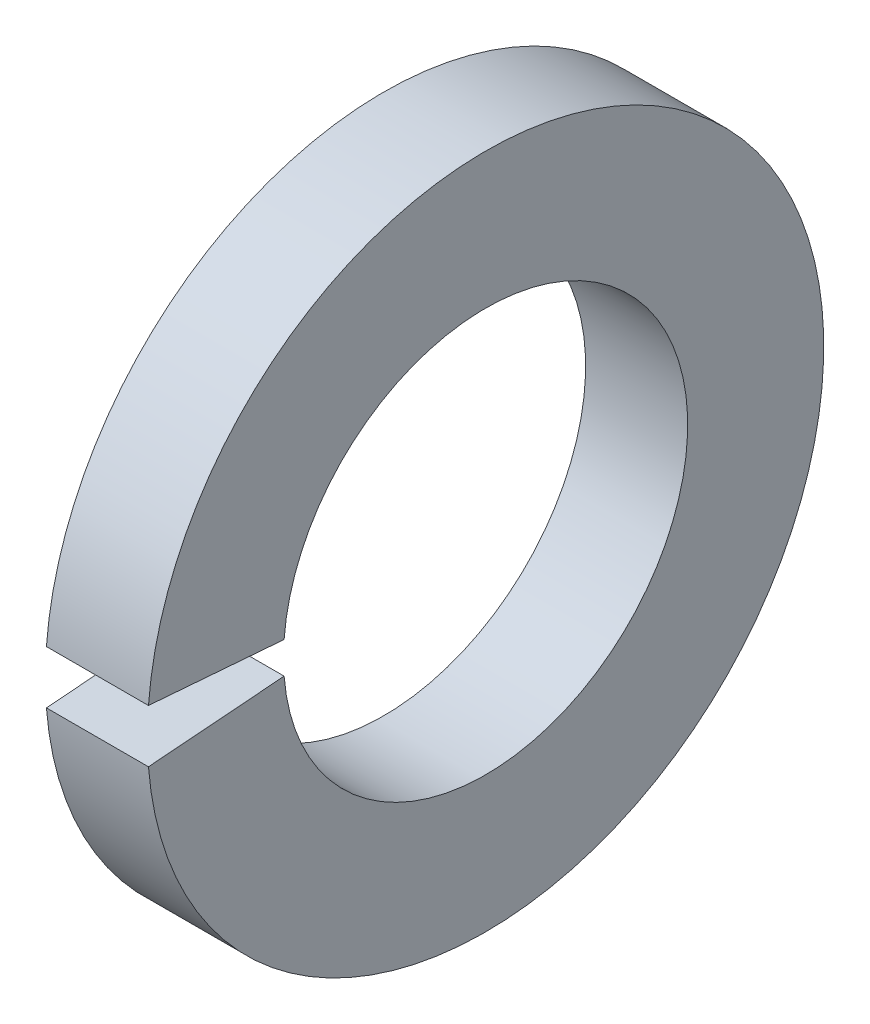
ISO-10303-21;
HEADER;
FILE_DESCRIPTION(('STEP AP214'),'2;1');
FILE_NAME('part.step','',(''),(''),'','','');
FILE_SCHEMA(('AUTOMOTIVE_DESIGN { 1 0 10303 214 1 1 1 1 }'));
ENDSEC;
DATA;
#1=APPLICATION_CONTEXT('core data for automotive mechanical design processes');
#2=APPLICATION_PROTOCOL_DEFINITION('international standard','automotive_design',2000,#1);
#3=PRODUCT_CONTEXT('',#1,'mechanical');
#4=PRODUCT('Part','Part','',(#3));
#5=PRODUCT_RELATED_PRODUCT_CATEGORY('part','',(#4));
#6=PRODUCT_DEFINITION_FORMATION('','',#4);
#7=PRODUCT_DEFINITION_CONTEXT('part definition',#1,'design');
#8=PRODUCT_DEFINITION('design','',#6,#7);
#9=PRODUCT_DEFINITION_SHAPE('','',#8);
#10=(LENGTH_UNIT() NAMED_UNIT(*) SI_UNIT(.MILLI.,.METRE.));
#11=(NAMED_UNIT(*) PLANE_ANGLE_UNIT() SI_UNIT($,.RADIAN.));
#12=(NAMED_UNIT(*) SI_UNIT($,.STERADIAN.) SOLID_ANGLE_UNIT());
#13=UNCERTAINTY_MEASURE_WITH_UNIT(LENGTH_MEASURE(1.E-05),#10,'distance_accuracy_value','');
#14=(GEOMETRIC_REPRESENTATION_CONTEXT(3) GLOBAL_UNCERTAINTY_ASSIGNED_CONTEXT((#13)) GLOBAL_UNIT_ASSIGNED_CONTEXT((#10,
#11,#12)) REPRESENTATION_CONTEXT('',''));
#15=CARTESIAN_POINT('',(0.,0.,0.));
#16=DIRECTION('',(0.,0.,1.));
#17=DIRECTION('',(1.,0.,0.));
#18=AXIS2_PLACEMENT_3D('',#15,#16,#17);
#19=CARTESIAN_POINT('',(-34.9249999999999,0.,0.));
#20=DIRECTION('',(-1.,0.,0.));
#21=DIRECTION('',(0.,0.,1.));
#22=AXIS2_PLACEMENT_3D('',#19,#20,#21);
#23=CYLINDRICAL_SURFACE('',#22,10.1);
#24=CARTESIAN_POINT('',(0.,0.,0.));
#25=DIRECTION('',(-1.,0.,0.));
#26=DIRECTION('',(0.,0.,1.));
#27=AXIS2_PLACEMENT_3D('',#24,#25,#26);
#28=CIRCLE('',#27,10.1);
#29=CARTESIAN_POINT('',(0.,0.792436866851241,10.0688650707046));
#30=VERTEX_POINT('',#29);
#31=CARTESIAN_POINT('',(0.,-0.792436866851241,10.0688650707046));
#32=VERTEX_POINT('',#31);
#33=EDGE_CURVE('E83',#30,#32,#28,.T.);
#34=ORIENTED_EDGE('',*,*,#33,.F.);
#35=DIRECTION('',(-1.,0.,0.));
#36=VECTOR('',#35,1.);
#37=CARTESIAN_POINT('',(-34.9249999999999,0.792436866851241,10.0688650707046));
#38=LINE('',#37,#36);
#39=CARTESIAN_POINT('',(-5.1,0.792436866851241,10.0688650707046));
#40=VERTEX_POINT('',#39);
#41=EDGE_CURVE('E97',#30,#40,#38,.T.);
#42=ORIENTED_EDGE('',*,*,#41,.T.);
#43=CARTESIAN_POINT('',(-5.1,0.,0.));
#44=DIRECTION('',(-1.,0.,0.));
#45=DIRECTION('',(0.,0.,1.));
#46=AXIS2_PLACEMENT_3D('',#43,#44,#45);
#47=CIRCLE('',#46,10.1);
#48=CARTESIAN_POINT('',(-5.1,-0.792436866851241,10.0688650707046));
#49=VERTEX_POINT('',#48);
#50=EDGE_CURVE('E85',#40,#49,#47,.T.);
#51=ORIENTED_EDGE('',*,*,#50,.T.);
#52=DIRECTION('',(-1.,0.,0.));
#53=VECTOR('',#52,1.);
#54=CARTESIAN_POINT('',(-34.9249999999999,-0.792436866851241,10.0688650707046));
#55=LINE('',#54,#53);
#56=EDGE_CURVE('E53',#32,#49,#55,.T.);
#57=ORIENTED_EDGE('',*,*,#56,.F.);
#58=EDGE_LOOP('',(#34,#42,#51,#57));
#59=FACE_BOUND('',#58,.T.);
#60=ADVANCED_FACE('F32',(#59),#23,.F.);
#61=CARTESIAN_POINT('',(0.,10.1,0.));
#62=DIRECTION('',(-1.,0.,0.));
#63=DIRECTION('',(0.,0.,1.));
#64=AXIS2_PLACEMENT_3D('',#61,#62,#63);
#65=PLANE('',#64);
#66=CARTESIAN_POINT('',(0.,0.,0.));
#67=DIRECTION('',(-1.,0.,0.));
#68=DIRECTION('',(0.,0.,1.));
#69=AXIS2_PLACEMENT_3D('',#66,#67,#68);
#70=CIRCLE('',#69,16.9);
#71=CARTESIAN_POINT('',(0.,1.32595871780059,16.8479029400899));
#72=VERTEX_POINT('',#71);
#73=CARTESIAN_POINT('',(0.,-1.32595871780059,16.8479029400899));
#74=VERTEX_POINT('',#73);
#75=EDGE_CURVE('E89',#72,#74,#70,.T.);
#76=ORIENTED_EDGE('',*,*,#75,.F.);
#77=DIRECTION('',(0.,0.0784590957278456,0.996917333733128));
#78=VECTOR('',#77,1.);
#79=CARTESIAN_POINT('',(0.,0.,0.));
#80=LINE('',#79,#78);
#81=EDGE_CURVE('E77',#30,#72,#80,.T.);
#82=ORIENTED_EDGE('',*,*,#81,.F.);
#83=ORIENTED_EDGE('',*,*,#33,.T.);
#84=DIRECTION('',(0.,-0.0784590957278456,0.996917333733128));
#85=VECTOR('',#84,1.);
#86=CARTESIAN_POINT('',(0.,0.,0.));
#87=LINE('',#86,#85);
#88=EDGE_CURVE('E69',#32,#74,#87,.T.);
#89=ORIENTED_EDGE('',*,*,#88,.T.);
#90=EDGE_LOOP('',(#76,#82,#83,#89));
#91=FACE_BOUND('',#90,.T.);
#92=ADVANCED_FACE('F88',(#91),#65,.F.);
#93=CARTESIAN_POINT('',(-34.9249999999999,0.,0.));
#94=DIRECTION('',(-1.,0.,0.));
#95=DIRECTION('',(0.,0.,1.));
#96=AXIS2_PLACEMENT_3D('',#93,#94,#95);
#97=CYLINDRICAL_SURFACE('',#96,16.9);
#98=CARTESIAN_POINT('',(-5.1,0.,0.));
#99=DIRECTION('',(-1.,0.,0.));
#100=DIRECTION('',(0.,0.,1.));
#101=AXIS2_PLACEMENT_3D('',#98,#99,#100);
#102=CIRCLE('',#101,16.9);
#103=CARTESIAN_POINT('',(-5.1,1.32595871780059,16.8479029400899));
#104=VERTEX_POINT('',#103);
#105=CARTESIAN_POINT('',(-5.1,-1.32595871780059,16.8479029400899));
#106=VERTEX_POINT('',#105);
#107=EDGE_CURVE('E91',#104,#106,#102,.T.);
#108=ORIENTED_EDGE('',*,*,#107,.F.);
#109=DIRECTION('',(-1.,0.,0.));
#110=VECTOR('',#109,1.);
#111=CARTESIAN_POINT('',(-34.9249999999999,1.32595871780059,16.8479029400899));
#112=LINE('',#111,#110);
#113=EDGE_CURVE('E46',#104,#72,#112,.F.);
#114=ORIENTED_EDGE('',*,*,#113,.T.);
#115=ORIENTED_EDGE('',*,*,#75,.T.);
#116=DIRECTION('',(-1.,0.,0.));
#117=VECTOR('',#116,1.);
#118=CARTESIAN_POINT('',(-34.9249999999999,-1.32595871780059,16.8479029400899));
#119=LINE('',#118,#117);
#120=EDGE_CURVE('E72',#106,#74,#119,.F.);
#121=ORIENTED_EDGE('',*,*,#120,.F.);
#122=EDGE_LOOP('',(#108,#114,#115,#121));
#123=FACE_BOUND('',#122,.T.);
#124=ADVANCED_FACE('F104',(#123),#97,.T.);
#125=CARTESIAN_POINT('',(-5.1,16.9,0.));
#126=DIRECTION('',(1.,0.,0.));
#127=DIRECTION('',(0.,0.,-1.));
#128=AXIS2_PLACEMENT_3D('',#125,#126,#127);
#129=PLANE('',#128);
#130=ORIENTED_EDGE('',*,*,#50,.F.);
#131=DIRECTION('',(0.,0.0784590957278456,0.996917333733128));
#132=VECTOR('',#131,1.);
#133=CARTESIAN_POINT('',(-5.1,0.104033521971088,1.32187122958996));
#134=LINE('',#133,#132);
#135=EDGE_CURVE('E11',#40,#104,#134,.T.);
#136=ORIENTED_EDGE('',*,*,#135,.T.);
#137=ORIENTED_EDGE('',*,*,#107,.T.);
#138=DIRECTION('',(0.,-0.0784590957278456,0.996917333733128));
#139=VECTOR('',#138,1.);
#140=CARTESIAN_POINT('',(-5.1,0.104033521971088,-1.32187122958996));
#141=LINE('',#140,#139);
#142=EDGE_CURVE('E39',#49,#106,#141,.T.);
#143=ORIENTED_EDGE('',*,*,#142,.F.);
#144=EDGE_LOOP('',(#130,#136,#137,#143));
#145=FACE_BOUND('',#144,.T.);
#146=ADVANCED_FACE('F106',(#145),#129,.F.);
#147=CARTESIAN_POINT('',(-5.1,0.,0.));
#148=DIRECTION('',(0.,0.996917333733128,0.0784590957278456));
#149=DIRECTION('',(0.,-0.0784590957278456,0.996917333733128));
#150=AXIS2_PLACEMENT_3D('',#147,#148,#149);
#151=PLANE('',#150);
#152=ORIENTED_EDGE('',*,*,#56,.T.);
#153=ORIENTED_EDGE('',*,*,#142,.T.);
#154=ORIENTED_EDGE('',*,*,#120,.T.);
#155=ORIENTED_EDGE('',*,*,#88,.F.);
#156=EDGE_LOOP('',(#152,#153,#154,#155));
#157=FACE_BOUND('',#156,.T.);
#158=ADVANCED_FACE('F70',(#157),#151,.T.);
#159=CARTESIAN_POINT('',(-5.1,0.,0.));
#160=DIRECTION('',(0.,0.996917333733128,-0.0784590957278456));
#161=DIRECTION('',(0.,0.0784590957278456,0.996917333733128));
#162=AXIS2_PLACEMENT_3D('',#159,#160,#161);
#163=PLANE('',#162);
#164=ORIENTED_EDGE('',*,*,#81,.T.);
#165=ORIENTED_EDGE('',*,*,#113,.F.);
#166=ORIENTED_EDGE('',*,*,#135,.F.);
#167=ORIENTED_EDGE('',*,*,#41,.F.);
#168=EDGE_LOOP('',(#164,#165,#166,#167));
#169=FACE_BOUND('',#168,.T.);
#170=ADVANCED_FACE('F101',(#169),#163,.F.);
#171=CLOSED_SHELL('',(#60,#92,#124,#146,#158,#170));
#172=MANIFOLD_SOLID_BREP('B2',#171);
#173=ADVANCED_BREP_SHAPE_REPRESENTATION('',(#18,#172),#14);
#174=SHAPE_DEFINITION_REPRESENTATION(#9,#173);
ENDSEC;
END-ISO-10303-21;
